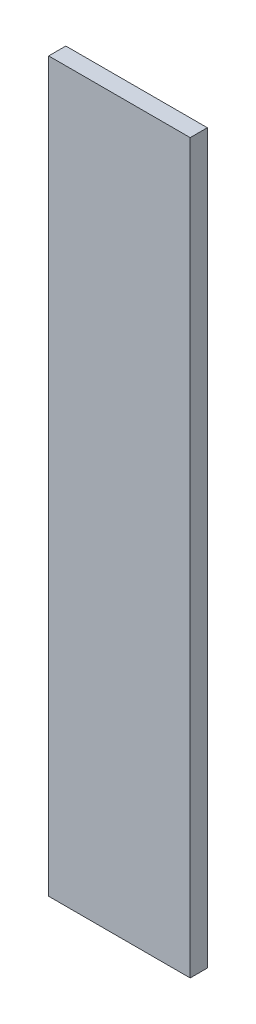
ISO-10303-21;
HEADER;
FILE_DESCRIPTION(('STEP AP214'),'2;1');
FILE_NAME('part.step','',(''),(''),'','','');
FILE_SCHEMA(('AUTOMOTIVE_DESIGN { 1 0 10303 214 1 1 1 1 }'));
ENDSEC;
DATA;
#1=APPLICATION_CONTEXT('core data for automotive mechanical design processes');
#2=APPLICATION_PROTOCOL_DEFINITION('international standard','automotive_design',2000,#1);
#3=PRODUCT_CONTEXT('',#1,'mechanical');
#4=PRODUCT('Part','Part','',(#3));
#5=PRODUCT_RELATED_PRODUCT_CATEGORY('part','',(#4));
#6=PRODUCT_DEFINITION_FORMATION('','',#4);
#7=PRODUCT_DEFINITION_CONTEXT('part definition',#1,'design');
#8=PRODUCT_DEFINITION('design','',#6,#7);
#9=PRODUCT_DEFINITION_SHAPE('','',#8);
#10=(LENGTH_UNIT() NAMED_UNIT(*) SI_UNIT(.MILLI.,.METRE.));
#11=(NAMED_UNIT(*) PLANE_ANGLE_UNIT() SI_UNIT($,.RADIAN.));
#12=(NAMED_UNIT(*) SI_UNIT($,.STERADIAN.) SOLID_ANGLE_UNIT());
#13=UNCERTAINTY_MEASURE_WITH_UNIT(LENGTH_MEASURE(1.E-05),#10,'distance_accuracy_value','');
#14=(GEOMETRIC_REPRESENTATION_CONTEXT(3) GLOBAL_UNCERTAINTY_ASSIGNED_CONTEXT((#13)) GLOBAL_UNIT_ASSIGNED_CONTEXT((#10,
#11,#12)) REPRESENTATION_CONTEXT('',''));
#15=CARTESIAN_POINT('',(0.,0.,0.));
#16=DIRECTION('',(0.,0.,1.));
#17=DIRECTION('',(1.,0.,0.));
#18=AXIS2_PLACEMENT_3D('',#15,#16,#17);
#19=CARTESIAN_POINT('',(-51.6047380575263,-32.3350168492635,2.6924));
#20=DIRECTION('',(1.,0.,0.));
#21=DIRECTION('',(0.,0.,-1.));
#22=AXIS2_PLACEMENT_3D('',#19,#20,#21);
#23=PLANE('',#22);
#24=DIRECTION('',(0.,-1.,0.));
#25=VECTOR('',#24,1.);
#26=CARTESIAN_POINT('',(-51.6047380575263,-32.3350168492635,0.));
#27=LINE('',#26,#25);
#28=CARTESIAN_POINT('',(-51.6047380575263,81.9649831507365,0.));
#29=VERTEX_POINT('',#28);
#30=CARTESIAN_POINT('',(-51.6047380575263,-32.3350168492635,0.));
#31=VERTEX_POINT('',#30);
#32=EDGE_CURVE('E96',#29,#31,#27,.T.);
#33=ORIENTED_EDGE('',*,*,#32,.T.);
#34=DIRECTION('',(0.,0.,-1.));
#35=VECTOR('',#34,1.);
#36=CARTESIAN_POINT('',(-51.6047380575263,-32.3350168492635,2.6924));
#37=LINE('',#36,#35);
#38=CARTESIAN_POINT('',(-51.6047380575263,-32.3350168492635,2.6924));
#39=VERTEX_POINT('',#38);
#40=EDGE_CURVE('E11',#39,#31,#37,.T.);
#41=ORIENTED_EDGE('',*,*,#40,.F.);
#42=DIRECTION('',(0.,-1.,0.));
#43=VECTOR('',#42,1.);
#44=CARTESIAN_POINT('',(-51.6047380575263,-32.3350168492635,2.6924));
#45=LINE('',#44,#43);
#46=CARTESIAN_POINT('',(-51.6047380575263,81.9649831507365,2.6924));
#47=VERTEX_POINT('',#46);
#48=EDGE_CURVE('E84',#47,#39,#45,.T.);
#49=ORIENTED_EDGE('',*,*,#48,.F.);
#50=DIRECTION('',(0.,0.,-1.));
#51=VECTOR('',#50,1.);
#52=CARTESIAN_POINT('',(-51.6047380575263,81.9649831507365,2.6924));
#53=LINE('',#52,#51);
#54=EDGE_CURVE('E92',#47,#29,#53,.T.);
#55=ORIENTED_EDGE('',*,*,#54,.T.);
#56=EDGE_LOOP('',(#33,#41,#49,#55));
#57=FACE_BOUND('',#56,.T.);
#58=ADVANCED_FACE('F33',(#57),#23,.F.);
#59=CARTESIAN_POINT('',(-51.6047380575263,-32.3350168492635,2.6924));
#60=DIRECTION('',(0.,1.,0.));
#61=DIRECTION('',(0.,0.,1.));
#62=AXIS2_PLACEMENT_3D('',#59,#60,#61);
#63=PLANE('',#62);
#64=DIRECTION('',(1.,0.,0.));
#65=VECTOR('',#64,1.);
#66=CARTESIAN_POINT('',(-51.6047380575263,-32.3350168492635,0.));
#67=LINE('',#66,#65);
#68=CARTESIAN_POINT('',(-29.3797380575263,-32.3350168492635,0.));
#69=VERTEX_POINT('',#68);
#70=EDGE_CURVE('E88',#31,#69,#67,.T.);
#71=ORIENTED_EDGE('',*,*,#70,.T.);
#72=DIRECTION('',(0.,0.,-1.));
#73=VECTOR('',#72,1.);
#74=CARTESIAN_POINT('',(-29.3797380575263,-32.3350168492635,2.6924));
#75=LINE('',#74,#73);
#76=CARTESIAN_POINT('',(-29.3797380575263,-32.3350168492635,2.6924));
#77=VERTEX_POINT('',#76);
#78=EDGE_CURVE('E41',#77,#69,#75,.T.);
#79=ORIENTED_EDGE('',*,*,#78,.F.);
#80=DIRECTION('',(1.,0.,0.));
#81=VECTOR('',#80,1.);
#82=CARTESIAN_POINT('',(-51.6047380575263,-32.3350168492635,2.6924));
#83=LINE('',#82,#81);
#84=EDGE_CURVE('E79',#39,#77,#83,.T.);
#85=ORIENTED_EDGE('',*,*,#84,.F.);
#86=ORIENTED_EDGE('',*,*,#40,.T.);
#87=EDGE_LOOP('',(#71,#79,#85,#86));
#88=FACE_BOUND('',#87,.T.);
#89=ADVANCED_FACE('F87',(#88),#63,.F.);
#90=CARTESIAN_POINT('',(-29.3797380575263,-32.3350168492635,2.6924));
#91=DIRECTION('',(-1.,0.,0.));
#92=DIRECTION('',(0.,0.,1.));
#93=AXIS2_PLACEMENT_3D('',#90,#91,#92);
#94=PLANE('',#93);
#95=DIRECTION('',(0.,1.,0.));
#96=VECTOR('',#95,1.);
#97=CARTESIAN_POINT('',(-29.3797380575263,-32.3350168492635,0.));
#98=LINE('',#97,#96);
#99=CARTESIAN_POINT('',(-29.3797380575263,81.9649831507365,0.));
#100=VERTEX_POINT('',#99);
#101=EDGE_CURVE('E66',#69,#100,#98,.T.);
#102=ORIENTED_EDGE('',*,*,#101,.T.);
#103=DIRECTION('',(0.,0.,-1.));
#104=VECTOR('',#103,1.);
#105=CARTESIAN_POINT('',(-29.3797380575263,81.9649831507365,2.6924));
#106=LINE('',#105,#104);
#107=CARTESIAN_POINT('',(-29.3797380575263,81.9649831507365,2.6924));
#108=VERTEX_POINT('',#107);
#109=EDGE_CURVE('E89',#108,#100,#106,.T.);
#110=ORIENTED_EDGE('',*,*,#109,.F.);
#111=DIRECTION('',(0.,1.,0.));
#112=VECTOR('',#111,1.);
#113=CARTESIAN_POINT('',(-29.3797380575263,-32.3350168492635,2.6924));
#114=LINE('',#113,#112);
#115=EDGE_CURVE('E82',#77,#108,#114,.T.);
#116=ORIENTED_EDGE('',*,*,#115,.F.);
#117=ORIENTED_EDGE('',*,*,#78,.T.);
#118=EDGE_LOOP('',(#102,#110,#116,#117));
#119=FACE_BOUND('',#118,.T.);
#120=ADVANCED_FACE('F90',(#119),#94,.F.);
#121=CARTESIAN_POINT('',(-51.6047380575263,81.9649831507365,2.6924));
#122=DIRECTION('',(0.,-1.,0.));
#123=DIRECTION('',(0.,0.,-1.));
#124=AXIS2_PLACEMENT_3D('',#121,#122,#123);
#125=PLANE('',#124);
#126=DIRECTION('',(-1.,0.,0.));
#127=VECTOR('',#126,1.);
#128=CARTESIAN_POINT('',(-51.6047380575263,81.9649831507365,0.));
#129=LINE('',#128,#127);
#130=EDGE_CURVE('E72',#100,#29,#129,.T.);
#131=ORIENTED_EDGE('',*,*,#130,.T.);
#132=ORIENTED_EDGE('',*,*,#54,.F.);
#133=DIRECTION('',(-1.,0.,0.));
#134=VECTOR('',#133,1.);
#135=CARTESIAN_POINT('',(-51.6047380575263,81.9649831507365,2.6924));
#136=LINE('',#135,#134);
#137=EDGE_CURVE('E49',#108,#47,#136,.T.);
#138=ORIENTED_EDGE('',*,*,#137,.F.);
#139=ORIENTED_EDGE('',*,*,#109,.T.);
#140=EDGE_LOOP('',(#131,#132,#138,#139));
#141=FACE_BOUND('',#140,.T.);
#142=ADVANCED_FACE('F103',(#141),#125,.F.);
#143=CARTESIAN_POINT('',(0.,0.,2.6924));
#144=DIRECTION('',(0.,0.,-1.));
#145=DIRECTION('',(-1.,0.,0.));
#146=AXIS2_PLACEMENT_3D('',#143,#144,#145);
#147=PLANE('',#146);
#148=ORIENTED_EDGE('',*,*,#48,.T.);
#149=ORIENTED_EDGE('',*,*,#84,.T.);
#150=ORIENTED_EDGE('',*,*,#115,.T.);
#151=ORIENTED_EDGE('',*,*,#137,.T.);
#152=EDGE_LOOP('',(#148,#149,#150,#151));
#153=FACE_BOUND('',#152,.T.);
#154=ADVANCED_FACE('F80',(#153),#147,.F.);
#155=CARTESIAN_POINT('',(0.,0.,0.));
#156=DIRECTION('',(0.,0.,-1.));
#157=DIRECTION('',(-1.,0.,0.));
#158=AXIS2_PLACEMENT_3D('',#155,#156,#157);
#159=PLANE('',#158);
#160=ORIENTED_EDGE('',*,*,#32,.F.);
#161=ORIENTED_EDGE('',*,*,#130,.F.);
#162=ORIENTED_EDGE('',*,*,#101,.F.);
#163=ORIENTED_EDGE('',*,*,#70,.F.);
#164=EDGE_LOOP('',(#160,#161,#162,#163));
#165=FACE_BOUND('',#164,.T.);
#166=ADVANCED_FACE('F106',(#165),#159,.T.);
#167=CLOSED_SHELL('',(#58,#89,#120,#142,#154,#166));
#168=MANIFOLD_SOLID_BREP('B2',#167);
#169=ADVANCED_BREP_SHAPE_REPRESENTATION('',(#18,#168),#14);
#170=SHAPE_DEFINITION_REPRESENTATION(#9,#169);
ENDSEC;
END-ISO-10303-21;
